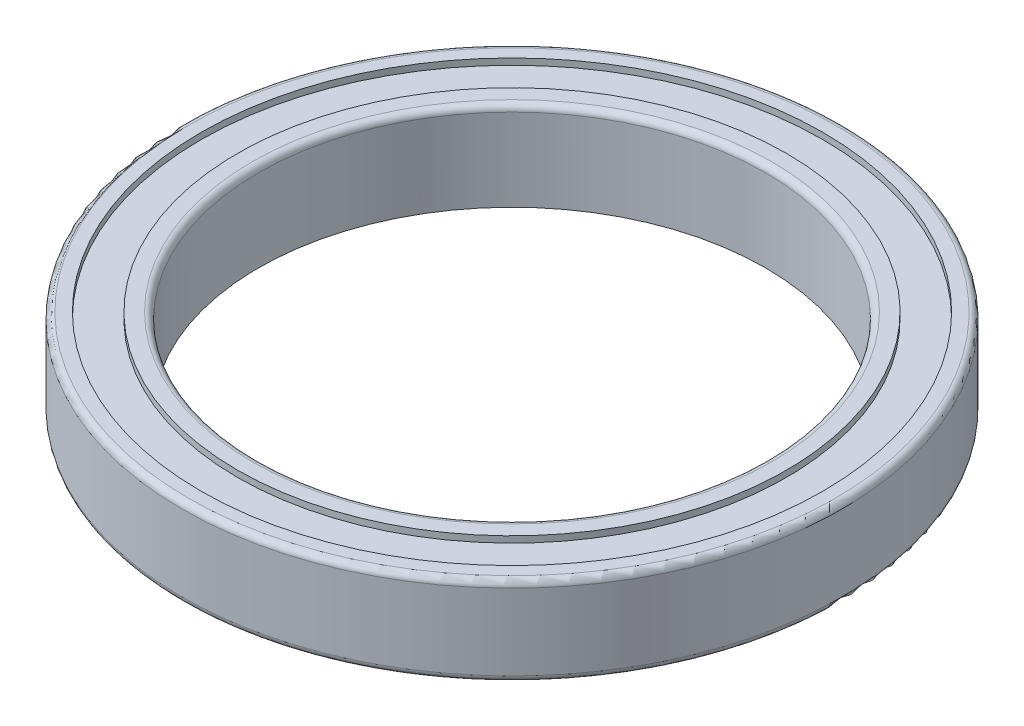
ISO-10303-21;
HEADER;
FILE_DESCRIPTION(('STEP AP214'),'2;1');
FILE_NAME('part.step','',(''),(''),'','','');
FILE_SCHEMA(('AUTOMOTIVE_DESIGN { 1 0 10303 214 1 1 1 1 }'));
ENDSEC;
DATA;
#1=APPLICATION_CONTEXT('core data for automotive mechanical design processes');
#2=APPLICATION_PROTOCOL_DEFINITION('international standard','automotive_design',2000,#1);
#3=PRODUCT_CONTEXT('',#1,'mechanical');
#4=PRODUCT('Part','Part','',(#3));
#5=PRODUCT_RELATED_PRODUCT_CATEGORY('part','',(#4));
#6=PRODUCT_DEFINITION_FORMATION('','',#4);
#7=PRODUCT_DEFINITION_CONTEXT('part definition',#1,'design');
#8=PRODUCT_DEFINITION('design','',#6,#7);
#9=PRODUCT_DEFINITION_SHAPE('','',#8);
#10=(LENGTH_UNIT() NAMED_UNIT(*) SI_UNIT(.MILLI.,.METRE.));
#11=(NAMED_UNIT(*) PLANE_ANGLE_UNIT() SI_UNIT($,.RADIAN.));
#12=(NAMED_UNIT(*) SI_UNIT($,.STERADIAN.) SOLID_ANGLE_UNIT());
#13=UNCERTAINTY_MEASURE_WITH_UNIT(LENGTH_MEASURE(1.E-05),#10,'distance_accuracy_value','');
#14=(GEOMETRIC_REPRESENTATION_CONTEXT(3) GLOBAL_UNCERTAINTY_ASSIGNED_CONTEXT((#13)) GLOBAL_UNIT_ASSIGNED_CONTEXT((#10,
#11,#12)) REPRESENTATION_CONTEXT('',''));
#15=CARTESIAN_POINT('',(0.,0.,0.));
#16=DIRECTION('',(0.,0.,1.));
#17=DIRECTION('',(1.,0.,0.));
#18=AXIS2_PLACEMENT_3D('',#15,#16,#17);
#19=CARTESIAN_POINT('',(0.,0.,0.));
#20=DIRECTION('',(0.,-1.,0.));
#21=DIRECTION('',(0.,0.,-1.));
#22=AXIS2_PLACEMENT_3D('',#19,#20,#21);
#23=CYLINDRICAL_SURFACE('',#22,20.);
#24=CARTESIAN_POINT('',(0.,6.5,0.));
#25=DIRECTION('',(0.,1.,0.));
#26=DIRECTION('',(0.,0.,1.));
#27=AXIS2_PLACEMENT_3D('',#24,#25,#26);
#28=CIRCLE('',#27,20.);
#29=CARTESIAN_POINT('',(0.,6.5,20.));
#30=VERTEX_POINT('',#29);
#31=EDGE_CURVE('E10',#30,#30,#28,.T.);
#32=ORIENTED_EDGE('',*,*,#31,.T.);
#33=EDGE_LOOP('',(#32));
#34=FACE_BOUND('',#33,.T.);
#35=CARTESIAN_POINT('',(0.,0.,0.));
#36=DIRECTION('',(0.,-1.,0.));
#37=DIRECTION('',(0.,0.,-1.));
#38=AXIS2_PLACEMENT_3D('',#35,#36,#37);
#39=CIRCLE('',#38,20.);
#40=CARTESIAN_POINT('',(0.,0.,-20.));
#41=VERTEX_POINT('',#40);
#42=EDGE_CURVE('E65',#41,#41,#39,.T.);
#43=ORIENTED_EDGE('',*,*,#42,.T.);
#44=EDGE_LOOP('',(#43));
#45=FACE_BOUND('',#44,.T.);
#46=ADVANCED_FACE('F39',(#34,#45),#23,.F.);
#47=CARTESIAN_POINT('',(20.,0.,0.));
#48=DIRECTION('',(0.,-1.,0.));
#49=DIRECTION('',(0.,0.,-1.));
#50=AXIS2_PLACEMENT_3D('',#47,#48,#49);
#51=PLANE('',#50);
#52=CARTESIAN_POINT('',(0.,0.,0.));
#53=DIRECTION('',(0.,-1.,0.));
#54=DIRECTION('',(0.,0.,-1.));
#55=AXIS2_PLACEMENT_3D('',#52,#53,#54);
#56=CIRCLE('',#55,21.65);
#57=CARTESIAN_POINT('',(0.,0.,-21.65));
#58=VERTEX_POINT('',#57);
#59=EDGE_CURVE('E68',#58,#58,#56,.T.);
#60=ORIENTED_EDGE('',*,*,#59,.T.);
#61=EDGE_LOOP('',(#60));
#62=FACE_BOUND('',#61,.T.);
#63=ORIENTED_EDGE('',*,*,#42,.F.);
#64=EDGE_LOOP('',(#63));
#65=FACE_BOUND('',#64,.T.);
#66=ADVANCED_FACE('F112',(#62,#65),#51,.T.);
#67=CARTESIAN_POINT('',(0.,0.,0.));
#68=DIRECTION('',(0.,-1.,0.));
#69=DIRECTION('',(0.,0.,-1.));
#70=AXIS2_PLACEMENT_3D('',#67,#68,#69);
#71=CYLINDRICAL_SURFACE('',#70,21.65);
#72=CARTESIAN_POINT('',(0.,0.5,0.));
#73=DIRECTION('',(0.,-1.,0.));
#74=DIRECTION('',(0.,0.,-1.));
#75=AXIS2_PLACEMENT_3D('',#72,#73,#74);
#76=CIRCLE('',#75,21.65);
#77=CARTESIAN_POINT('',(0.,0.5,-21.65));
#78=VERTEX_POINT('',#77);
#79=EDGE_CURVE('E72',#78,#78,#76,.T.);
#80=ORIENTED_EDGE('',*,*,#79,.T.);
#81=EDGE_LOOP('',(#80));
#82=FACE_BOUND('',#81,.T.);
#83=ORIENTED_EDGE('',*,*,#59,.F.);
#84=EDGE_LOOP('',(#83));
#85=FACE_BOUND('',#84,.T.);
#86=ADVANCED_FACE('F117',(#82,#85),#71,.T.);
#87=CARTESIAN_POINT('',(21.65,0.5,0.));
#88=DIRECTION('',(0.,-1.,0.));
#89=DIRECTION('',(0.,0.,-1.));
#90=AXIS2_PLACEMENT_3D('',#87,#88,#89);
#91=PLANE('',#90);
#92=CARTESIAN_POINT('',(0.,0.5,0.));
#93=DIRECTION('',(0.,-1.,0.));
#94=DIRECTION('',(0.,0.,-1.));
#95=AXIS2_PLACEMENT_3D('',#92,#93,#94);
#96=CIRCLE('',#95,24.525);
#97=CARTESIAN_POINT('',(0.,0.5,-24.525));
#98=VERTEX_POINT('',#97);
#99=EDGE_CURVE('E74',#98,#98,#96,.T.);
#100=ORIENTED_EDGE('',*,*,#99,.T.);
#101=EDGE_LOOP('',(#100));
#102=FACE_BOUND('',#101,.T.);
#103=ORIENTED_EDGE('',*,*,#79,.F.);
#104=EDGE_LOOP('',(#103));
#105=FACE_BOUND('',#104,.T.);
#106=ADVANCED_FACE('F147',(#102,#105),#91,.T.);
#107=CARTESIAN_POINT('',(0.,0.,0.));
#108=DIRECTION('',(0.,-1.,0.));
#109=DIRECTION('',(0.,0.,-1.));
#110=AXIS2_PLACEMENT_3D('',#107,#108,#109);
#111=CYLINDRICAL_SURFACE('',#110,24.525);
#112=CARTESIAN_POINT('',(0.,0.,0.));
#113=DIRECTION('',(0.,-1.,0.));
#114=DIRECTION('',(0.,0.,-1.));
#115=AXIS2_PLACEMENT_3D('',#112,#113,#114);
#116=CIRCLE('',#115,24.525);
#117=CARTESIAN_POINT('',(0.,0.,-24.525));
#118=VERTEX_POINT('',#117);
#119=EDGE_CURVE('E77',#118,#118,#116,.T.);
#120=ORIENTED_EDGE('',*,*,#119,.T.);
#121=EDGE_LOOP('',(#120));
#122=FACE_BOUND('',#121,.T.);
#123=ORIENTED_EDGE('',*,*,#99,.F.);
#124=EDGE_LOOP('',(#123));
#125=FACE_BOUND('',#124,.T.);
#126=ADVANCED_FACE('F141',(#122,#125),#111,.F.);
#127=CARTESIAN_POINT('',(24.525,0.,0.));
#128=DIRECTION('',(0.,-1.,0.));
#129=DIRECTION('',(0.,0.,-1.));
#130=AXIS2_PLACEMENT_3D('',#127,#128,#129);
#131=PLANE('',#130);
#132=CARTESIAN_POINT('',(0.,0.,0.));
#133=DIRECTION('',(0.,-1.,0.));
#134=DIRECTION('',(0.,0.,-1.));
#135=AXIS2_PLACEMENT_3D('',#132,#133,#134);
#136=CIRCLE('',#135,25.5);
#137=CARTESIAN_POINT('',(0.,0.,-25.5));
#138=VERTEX_POINT('',#137);
#139=EDGE_CURVE('E62',#138,#138,#136,.T.);
#140=ORIENTED_EDGE('',*,*,#139,.T.);
#141=EDGE_LOOP('',(#140));
#142=FACE_BOUND('',#141,.T.);
#143=ORIENTED_EDGE('',*,*,#119,.F.);
#144=EDGE_LOOP('',(#143));
#145=FACE_BOUND('',#144,.T.);
#146=ADVANCED_FACE('F135',(#142,#145),#131,.T.);
#147=CARTESIAN_POINT('',(0.,0.,0.));
#148=DIRECTION('',(0.,-1.,0.));
#149=DIRECTION('',(0.,0.,-1.));
#150=AXIS2_PLACEMENT_3D('',#147,#148,#149);
#151=CYLINDRICAL_SURFACE('',#150,26.);
#152=CARTESIAN_POINT('',(0.,0.499999999999999,0.));
#153=DIRECTION('',(0.,-1.,0.));
#154=DIRECTION('',(0.,0.,-1.));
#155=AXIS2_PLACEMENT_3D('',#152,#153,#154);
#156=CIRCLE('',#155,26.);
#157=CARTESIAN_POINT('',(0.,0.499999999999999,-26.));
#158=VERTEX_POINT('',#157);
#159=EDGE_CURVE('E53',#158,#158,#156,.F.);
#160=ORIENTED_EDGE('',*,*,#159,.T.);
#161=EDGE_LOOP('',(#160));
#162=FACE_BOUND('',#161,.T.);
#163=CARTESIAN_POINT('',(0.,6.5,0.));
#164=DIRECTION('',(0.,1.,0.));
#165=DIRECTION('',(0.,0.,1.));
#166=AXIS2_PLACEMENT_3D('',#163,#164,#165);
#167=CIRCLE('',#166,26.);
#168=CARTESIAN_POINT('',(0.,6.5,26.));
#169=VERTEX_POINT('',#168);
#170=EDGE_CURVE('E56',#169,#169,#167,.F.);
#171=ORIENTED_EDGE('',*,*,#170,.T.);
#172=EDGE_LOOP('',(#171));
#173=FACE_BOUND('',#172,.T.);
#174=ADVANCED_FACE('F132',(#162,#173),#151,.T.);
#175=CARTESIAN_POINT('',(26.,7.,0.));
#176=DIRECTION('',(0.,1.,0.));
#177=DIRECTION('',(0.,0.,1.));
#178=AXIS2_PLACEMENT_3D('',#175,#176,#177);
#179=PLANE('',#178);
#180=CARTESIAN_POINT('',(0.,7.,0.));
#181=DIRECTION('',(0.,1.,0.));
#182=DIRECTION('',(0.,0.,1.));
#183=AXIS2_PLACEMENT_3D('',#180,#181,#182);
#184=CIRCLE('',#183,25.5);
#185=CARTESIAN_POINT('',(0.,7.,25.5));
#186=VERTEX_POINT('',#185);
#187=EDGE_CURVE('E49',#186,#186,#184,.T.);
#188=ORIENTED_EDGE('',*,*,#187,.T.);
#189=EDGE_LOOP('',(#188));
#190=FACE_BOUND('',#189,.T.);
#191=CARTESIAN_POINT('',(0.,7.,0.));
#192=DIRECTION('',(0.,-1.,0.));
#193=DIRECTION('',(0.,0.,-1.));
#194=AXIS2_PLACEMENT_3D('',#191,#192,#193);
#195=CIRCLE('',#194,24.525);
#196=CARTESIAN_POINT('',(0.,7.,-24.525));
#197=VERTEX_POINT('',#196);
#198=EDGE_CURVE('E80',#197,#197,#195,.T.);
#199=ORIENTED_EDGE('',*,*,#198,.T.);
#200=EDGE_LOOP('',(#199));
#201=FACE_BOUND('',#200,.T.);
#202=ADVANCED_FACE('F133',(#190,#201),#179,.T.);
#203=CARTESIAN_POINT('',(0.,0.,0.));
#204=DIRECTION('',(0.,-1.,0.));
#205=DIRECTION('',(0.,0.,-1.));
#206=AXIS2_PLACEMENT_3D('',#203,#204,#205);
#207=CYLINDRICAL_SURFACE('',#206,24.525);
#208=CARTESIAN_POINT('',(0.,6.5,0.));
#209=DIRECTION('',(0.,-1.,0.));
#210=DIRECTION('',(0.,0.,-1.));
#211=AXIS2_PLACEMENT_3D('',#208,#209,#210);
#212=CIRCLE('',#211,24.525);
#213=CARTESIAN_POINT('',(0.,6.5,-24.525));
#214=VERTEX_POINT('',#213);
#215=EDGE_CURVE('E83',#214,#214,#212,.T.);
#216=ORIENTED_EDGE('',*,*,#215,.T.);
#217=EDGE_LOOP('',(#216));
#218=FACE_BOUND('',#217,.T.);
#219=ORIENTED_EDGE('',*,*,#198,.F.);
#220=EDGE_LOOP('',(#219));
#221=FACE_BOUND('',#220,.T.);
#222=ADVANCED_FACE('F136',(#218,#221),#207,.F.);
#223=CARTESIAN_POINT('',(24.525,6.5,0.));
#224=DIRECTION('',(0.,1.,0.));
#225=DIRECTION('',(0.,0.,1.));
#226=AXIS2_PLACEMENT_3D('',#223,#224,#225);
#227=PLANE('',#226);
#228=CARTESIAN_POINT('',(0.,6.5,0.));
#229=DIRECTION('',(0.,-1.,0.));
#230=DIRECTION('',(0.,0.,-1.));
#231=AXIS2_PLACEMENT_3D('',#228,#229,#230);
#232=CIRCLE('',#231,21.65);
#233=CARTESIAN_POINT('',(0.,6.5,-21.65));
#234=VERTEX_POINT('',#233);
#235=EDGE_CURVE('E88',#234,#234,#232,.T.);
#236=ORIENTED_EDGE('',*,*,#235,.T.);
#237=EDGE_LOOP('',(#236));
#238=FACE_BOUND('',#237,.T.);
#239=ORIENTED_EDGE('',*,*,#215,.F.);
#240=EDGE_LOOP('',(#239));
#241=FACE_BOUND('',#240,.T.);
#242=ADVANCED_FACE('F107',(#238,#241),#227,.T.);
#243=CARTESIAN_POINT('',(0.,0.,0.));
#244=DIRECTION('',(0.,-1.,0.));
#245=DIRECTION('',(0.,0.,-1.));
#246=AXIS2_PLACEMENT_3D('',#243,#244,#245);
#247=CYLINDRICAL_SURFACE('',#246,21.65);
#248=CARTESIAN_POINT('',(0.,7.,0.));
#249=DIRECTION('',(0.,-1.,0.));
#250=DIRECTION('',(0.,0.,-1.));
#251=AXIS2_PLACEMENT_3D('',#248,#249,#250);
#252=CIRCLE('',#251,21.65);
#253=CARTESIAN_POINT('',(0.,7.,-21.65));
#254=VERTEX_POINT('',#253);
#255=EDGE_CURVE('E90',#254,#254,#252,.T.);
#256=ORIENTED_EDGE('',*,*,#255,.T.);
#257=EDGE_LOOP('',(#256));
#258=FACE_BOUND('',#257,.T.);
#259=ORIENTED_EDGE('',*,*,#235,.F.);
#260=EDGE_LOOP('',(#259));
#261=FACE_BOUND('',#260,.T.);
#262=ADVANCED_FACE('F91',(#258,#261),#247,.T.);
#263=CARTESIAN_POINT('',(21.65,7.,0.));
#264=DIRECTION('',(0.,1.,0.));
#265=DIRECTION('',(0.,0.,1.));
#266=AXIS2_PLACEMENT_3D('',#263,#264,#265);
#267=PLANE('',#266);
#268=CARTESIAN_POINT('',(0.,7.,0.));
#269=DIRECTION('',(0.,1.,0.));
#270=DIRECTION('',(0.,0.,1.));
#271=AXIS2_PLACEMENT_3D('',#268,#269,#270);
#272=CIRCLE('',#271,20.5);
#273=CARTESIAN_POINT('',(0.,7.,20.5));
#274=VERTEX_POINT('',#273);
#275=EDGE_CURVE('E46',#274,#274,#272,.F.);
#276=ORIENTED_EDGE('',*,*,#275,.T.);
#277=EDGE_LOOP('',(#276));
#278=FACE_BOUND('',#277,.T.);
#279=ORIENTED_EDGE('',*,*,#255,.F.);
#280=EDGE_LOOP('',(#279));
#281=FACE_BOUND('',#280,.T.);
#282=ADVANCED_FACE('F96',(#278,#281),#267,.T.);
#283=CARTESIAN_POINT('',(0.,0.499999999999999,0.));
#284=DIRECTION('',(0.,-1.,0.));
#285=DIRECTION('',(0.,0.,-1.));
#286=AXIS2_PLACEMENT_3D('',#283,#284,#285);
#287=TOROIDAL_SURFACE('',#286,25.5,0.5);
#288=ORIENTED_EDGE('',*,*,#159,.F.);
#289=EDGE_LOOP('',(#288));
#290=FACE_BOUND('',#289,.T.);
#291=ORIENTED_EDGE('',*,*,#139,.F.);
#292=EDGE_LOOP('',(#291));
#293=FACE_BOUND('',#292,.T.);
#294=ADVANCED_FACE('F98',(#290,#293),#287,.T.);
#295=CARTESIAN_POINT('',(0.,6.5,0.));
#296=DIRECTION('',(0.,1.,0.));
#297=DIRECTION('',(0.,0.,1.));
#298=AXIS2_PLACEMENT_3D('',#295,#296,#297);
#299=TOROIDAL_SURFACE('',#298,25.5,0.5);
#300=ORIENTED_EDGE('',*,*,#187,.F.);
#301=EDGE_LOOP('',(#300));
#302=FACE_BOUND('',#301,.T.);
#303=ORIENTED_EDGE('',*,*,#170,.F.);
#304=EDGE_LOOP('',(#303));
#305=FACE_BOUND('',#304,.T.);
#306=ADVANCED_FACE('F102',(#302,#305),#299,.T.);
#307=CARTESIAN_POINT('',(0.,6.5,0.));
#308=DIRECTION('',(0.,1.,0.));
#309=DIRECTION('',(0.,0.,1.));
#310=AXIS2_PLACEMENT_3D('',#307,#308,#309);
#311=TOROIDAL_SURFACE('',#310,20.5,0.5);
#312=ORIENTED_EDGE('',*,*,#31,.F.);
#313=EDGE_LOOP('',(#312));
#314=FACE_BOUND('',#313,.T.);
#315=ORIENTED_EDGE('',*,*,#275,.F.);
#316=EDGE_LOOP('',(#315));
#317=FACE_BOUND('',#316,.T.);
#318=ADVANCED_FACE('F41',(#314,#317),#311,.T.);
#319=CLOSED_SHELL('',(#46,#66,#86,#106,#126,#146,#174,#202,#222,#242,#262,#282,#294,#306,#318));
#320=MANIFOLD_SOLID_BREP('B2',#319);
#321=ADVANCED_BREP_SHAPE_REPRESENTATION('',(#18,#320),#14);
#322=SHAPE_DEFINITION_REPRESENTATION(#9,#321);
ENDSEC;
END-ISO-10303-21;
